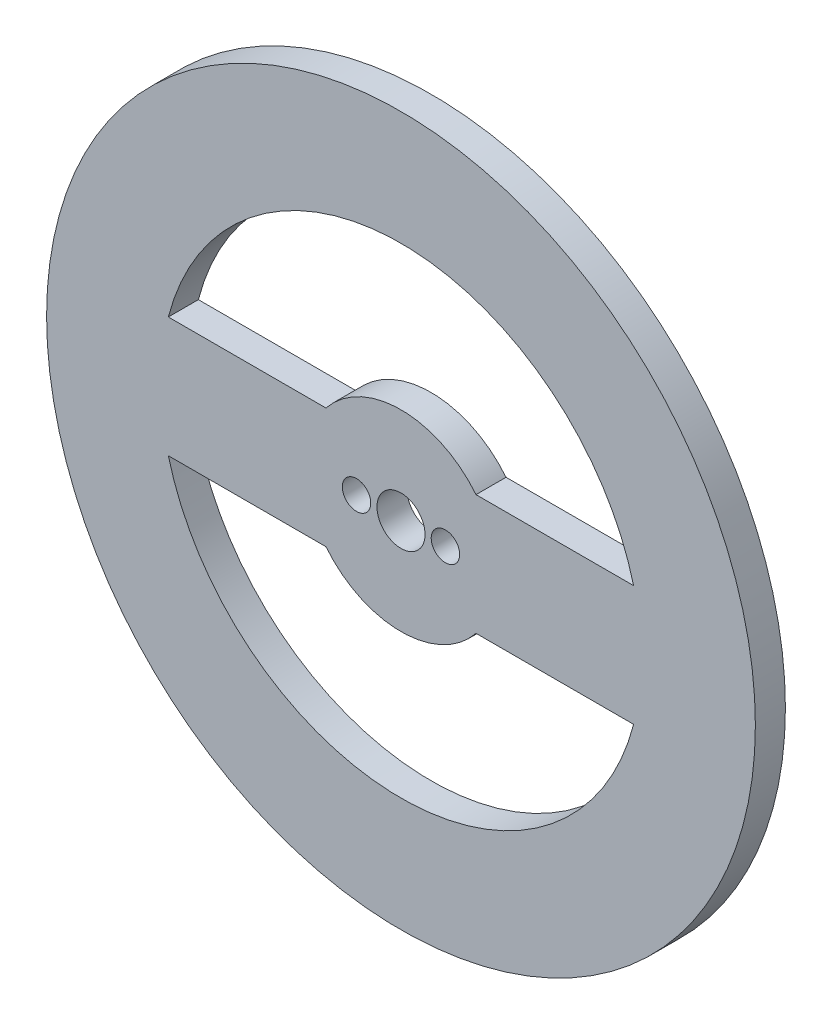
ISO-10303-21;
HEADER;
FILE_DESCRIPTION(('STEP AP214'),'2;1');
FILE_NAME('part.step','',(''),(''),'','','');
FILE_SCHEMA(('AUTOMOTIVE_DESIGN { 1 0 10303 214 1 1 1 1 }'));
ENDSEC;
DATA;
#1=APPLICATION_CONTEXT('core data for automotive mechanical design processes');
#2=APPLICATION_PROTOCOL_DEFINITION('international standard','automotive_design',2000,#1);
#3=PRODUCT_CONTEXT('',#1,'mechanical');
#4=PRODUCT('Part','Part','',(#3));
#5=PRODUCT_RELATED_PRODUCT_CATEGORY('part','',(#4));
#6=PRODUCT_DEFINITION_FORMATION('','',#4);
#7=PRODUCT_DEFINITION_CONTEXT('part definition',#1,'design');
#8=PRODUCT_DEFINITION('design','',#6,#7);
#9=PRODUCT_DEFINITION_SHAPE('','',#8);
#10=(LENGTH_UNIT() NAMED_UNIT(*) SI_UNIT(.MILLI.,.METRE.));
#11=(NAMED_UNIT(*) PLANE_ANGLE_UNIT() SI_UNIT($,.RADIAN.));
#12=(NAMED_UNIT(*) SI_UNIT($,.STERADIAN.) SOLID_ANGLE_UNIT());
#13=UNCERTAINTY_MEASURE_WITH_UNIT(LENGTH_MEASURE(1.E-05),#10,'distance_accuracy_value','');
#14=(GEOMETRIC_REPRESENTATION_CONTEXT(3) GLOBAL_UNCERTAINTY_ASSIGNED_CONTEXT((#13)) GLOBAL_UNIT_ASSIGNED_CONTEXT((#10,
#11,#12)) REPRESENTATION_CONTEXT('',''));
#15=CARTESIAN_POINT('',(0.,0.,0.));
#16=DIRECTION('',(0.,0.,1.));
#17=DIRECTION('',(1.,0.,0.));
#18=AXIS2_PLACEMENT_3D('',#15,#16,#17);
#19=CARTESIAN_POINT('',(0.,0.,3.175));
#20=DIRECTION('',(0.,0.,-1.));
#21=DIRECTION('',(-1.,0.,0.));
#22=AXIS2_PLACEMENT_3D('',#19,#20,#21);
#23=CYLINDRICAL_SURFACE('',#22,37.465);
#24=CARTESIAN_POINT('',(0.,0.,3.175));
#25=DIRECTION('',(0.,0.,1.));
#26=DIRECTION('',(1.,0.,0.));
#27=AXIS2_PLACEMENT_3D('',#24,#25,#26);
#28=CIRCLE('',#27,37.465);
#29=CARTESIAN_POINT('',(37.465,0.,3.175));
#30=VERTEX_POINT('',#29);
#31=EDGE_CURVE('E11',#30,#30,#28,.T.);
#32=ORIENTED_EDGE('',*,*,#31,.F.);
#33=EDGE_LOOP('',(#32));
#34=FACE_BOUND('',#33,.T.);
#35=CARTESIAN_POINT('',(0.,0.,0.));
#36=DIRECTION('',(0.,0.,1.));
#37=DIRECTION('',(1.,0.,0.));
#38=AXIS2_PLACEMENT_3D('',#35,#36,#37);
#39=CIRCLE('',#38,37.465);
#40=CARTESIAN_POINT('',(37.465,0.,0.));
#41=VERTEX_POINT('',#40);
#42=EDGE_CURVE('E35',#41,#41,#39,.T.);
#43=ORIENTED_EDGE('',*,*,#42,.T.);
#44=EDGE_LOOP('',(#43));
#45=FACE_BOUND('',#44,.T.);
#46=ADVANCED_FACE('F32',(#34,#45),#23,.T.);
#47=CARTESIAN_POINT('',(0.,0.,3.175));
#48=DIRECTION('',(0.,0.,1.));
#49=DIRECTION('',(1.,0.,0.));
#50=AXIS2_PLACEMENT_3D('',#47,#48,#49);
#51=PLANE('',#50);
#52=CARTESIAN_POINT('',(-4.69900000000336,0.,3.175));
#53=DIRECTION('',(0.,0.,-1.));
#54=DIRECTION('',(-1.,0.,0.));
#55=AXIS2_PLACEMENT_3D('',#52,#53,#54);
#56=CIRCLE('',#55,1.505);
#57=CARTESIAN_POINT('',(-6.20400000000336,0.,3.175));
#58=VERTEX_POINT('',#57);
#59=EDGE_CURVE('E246',#58,#58,#56,.T.);
#60=ORIENTED_EDGE('',*,*,#59,.T.);
#61=EDGE_LOOP('',(#60));
#62=FACE_BOUND('',#61,.T.);
#63=CARTESIAN_POINT('',(4.69899999999664,0.,3.175));
#64=DIRECTION('',(0.,0.,-1.));
#65=DIRECTION('',(-1.,0.,0.));
#66=AXIS2_PLACEMENT_3D('',#63,#64,#65);
#67=CIRCLE('',#66,1.505);
#68=CARTESIAN_POINT('',(3.19399999999664,0.,3.175));
#69=VERTEX_POINT('',#68);
#70=EDGE_CURVE('E253',#69,#69,#67,.T.);
#71=ORIENTED_EDGE('',*,*,#70,.T.);
#72=EDGE_LOOP('',(#71));
#73=FACE_BOUND('',#72,.T.);
#74=CARTESIAN_POINT('',(0.,0.,3.175));
#75=DIRECTION('',(0.,0.,1.));
#76=DIRECTION('',(1.,0.,0.));
#77=AXIS2_PLACEMENT_3D('',#74,#75,#76);
#78=CIRCLE('',#77,2.54);
#79=CARTESIAN_POINT('',(2.54,0.,3.175));
#80=VERTEX_POINT('',#79);
#81=EDGE_CURVE('E120',#80,#80,#78,.T.);
#82=ORIENTED_EDGE('',*,*,#81,.F.);
#83=EDGE_LOOP('',(#82));
#84=FACE_BOUND('',#83,.T.);
#85=CARTESIAN_POINT('',(0.,0.,3.175));
#86=DIRECTION('',(0.,0.,1.));
#87=DIRECTION('',(1.,0.,0.));
#88=AXIS2_PLACEMENT_3D('',#85,#86,#87);
#89=CIRCLE('',#88,25.4);
#90=CARTESIAN_POINT('',(-24.5934442484171,-6.35,3.175));
#91=VERTEX_POINT('',#90);
#92=CARTESIAN_POINT('',(24.5934442484171,-6.35,3.175));
#93=VERTEX_POINT('',#92);
#94=EDGE_CURVE('E46',#91,#93,#89,.T.);
#95=ORIENTED_EDGE('',*,*,#94,.F.);
#96=DIRECTION('',(-1.,0.,0.));
#97=VECTOR('',#96,1.);
#98=CARTESIAN_POINT('',(-24.5934442484171,-6.35,3.175));
#99=LINE('',#98,#97);
#100=CARTESIAN_POINT('',(-7.93114745796596,-6.35,3.175));
#101=VERTEX_POINT('',#100);
#102=EDGE_CURVE('E114',#101,#91,#99,.T.);
#103=ORIENTED_EDGE('',*,*,#102,.F.);
#104=CARTESIAN_POINT('',(0.,0.,3.175));
#105=DIRECTION('',(0.,0.,-1.));
#106=DIRECTION('',(1.,0.,0.));
#107=AXIS2_PLACEMENT_3D('',#104,#105,#106);
#108=CIRCLE('',#107,10.16);
#109=CARTESIAN_POINT('',(7.93114745796596,-6.35,3.175));
#110=VERTEX_POINT('',#109);
#111=EDGE_CURVE('E117',#110,#101,#108,.T.);
#112=ORIENTED_EDGE('',*,*,#111,.F.);
#113=DIRECTION('',(-1.,0.,0.));
#114=VECTOR('',#113,1.);
#115=CARTESIAN_POINT('',(7.93114745796596,-6.35,3.175));
#116=LINE('',#115,#114);
#117=EDGE_CURVE('E126',#93,#110,#116,.T.);
#118=ORIENTED_EDGE('',*,*,#117,.F.);
#119=EDGE_LOOP('',(#95,#103,#112,#118));
#120=FACE_BOUND('',#119,.T.);
#121=CARTESIAN_POINT('',(0.,0.,3.175));
#122=DIRECTION('',(0.,0.,-1.));
#123=DIRECTION('',(1.,0.,0.));
#124=AXIS2_PLACEMENT_3D('',#121,#122,#123);
#125=CIRCLE('',#124,10.16);
#126=CARTESIAN_POINT('',(-7.93114745796596,6.35,3.175));
#127=VERTEX_POINT('',#126);
#128=CARTESIAN_POINT('',(7.93114745796597,6.35,3.175));
#129=VERTEX_POINT('',#128);
#130=EDGE_CURVE('E133',#127,#129,#125,.T.);
#131=ORIENTED_EDGE('',*,*,#130,.F.);
#132=DIRECTION('',(1.,0.,0.));
#133=VECTOR('',#132,1.);
#134=CARTESIAN_POINT('',(-24.5934442484171,6.35,3.175));
#135=LINE('',#134,#133);
#136=CARTESIAN_POINT('',(-24.5934442484171,6.35000000000001,3.175));
#137=VERTEX_POINT('',#136);
#138=EDGE_CURVE('E141',#137,#127,#135,.T.);
#139=ORIENTED_EDGE('',*,*,#138,.F.);
#140=CARTESIAN_POINT('',(0.,0.,3.175));
#141=DIRECTION('',(0.,0.,1.));
#142=DIRECTION('',(1.,0.,0.));
#143=AXIS2_PLACEMENT_3D('',#140,#141,#142);
#144=CIRCLE('',#143,25.4);
#145=CARTESIAN_POINT('',(24.5934442484171,6.35,3.175));
#146=VERTEX_POINT('',#145);
#147=EDGE_CURVE('E155',#146,#137,#144,.T.);
#148=ORIENTED_EDGE('',*,*,#147,.F.);
#149=DIRECTION('',(1.,0.,0.));
#150=VECTOR('',#149,1.);
#151=CARTESIAN_POINT('',(7.93114745796597,6.35,3.175));
#152=LINE('',#151,#150);
#153=EDGE_CURVE('E152',#129,#146,#152,.T.);
#154=ORIENTED_EDGE('',*,*,#153,.F.);
#155=EDGE_LOOP('',(#131,#139,#148,#154));
#156=FACE_BOUND('',#155,.T.);
#157=ORIENTED_EDGE('',*,*,#31,.T.);
#158=EDGE_LOOP('',(#157));
#159=FACE_BOUND('',#158,.T.);
#160=ADVANCED_FACE('F177',(#62,#73,#84,#120,#156,#159),#51,.T.);
#161=CARTESIAN_POINT('',(0.,0.,0.));
#162=DIRECTION('',(0.,0.,1.));
#163=DIRECTION('',(1.,0.,0.));
#164=AXIS2_PLACEMENT_3D('',#161,#162,#163);
#165=PLANE('',#164);
#166=CARTESIAN_POINT('',(-4.69900000000336,0.,0.));
#167=DIRECTION('',(0.,0.,-1.));
#168=DIRECTION('',(-1.,0.,0.));
#169=AXIS2_PLACEMENT_3D('',#166,#167,#168);
#170=CIRCLE('',#169,1.505);
#171=CARTESIAN_POINT('',(-6.20400000000336,0.,0.));
#172=VERTEX_POINT('',#171);
#173=EDGE_CURVE('E248',#172,#172,#170,.T.);
#174=ORIENTED_EDGE('',*,*,#173,.F.);
#175=EDGE_LOOP('',(#174));
#176=FACE_BOUND('',#175,.T.);
#177=CARTESIAN_POINT('',(4.69899999999664,0.,0.));
#178=DIRECTION('',(0.,0.,-1.));
#179=DIRECTION('',(-1.,0.,0.));
#180=AXIS2_PLACEMENT_3D('',#177,#178,#179);
#181=CIRCLE('',#180,1.505);
#182=CARTESIAN_POINT('',(3.19399999999664,0.,0.));
#183=VERTEX_POINT('',#182);
#184=EDGE_CURVE('E250',#183,#183,#181,.T.);
#185=ORIENTED_EDGE('',*,*,#184,.F.);
#186=EDGE_LOOP('',(#185));
#187=FACE_BOUND('',#186,.T.);
#188=CARTESIAN_POINT('',(0.,0.,0.));
#189=DIRECTION('',(0.,0.,1.));
#190=DIRECTION('',(1.,0.,0.));
#191=AXIS2_PLACEMENT_3D('',#188,#189,#190);
#192=CIRCLE('',#191,2.54);
#193=CARTESIAN_POINT('',(2.54,0.,0.));
#194=VERTEX_POINT('',#193);
#195=EDGE_CURVE('E127',#194,#194,#192,.T.);
#196=ORIENTED_EDGE('',*,*,#195,.T.);
#197=EDGE_LOOP('',(#196));
#198=FACE_BOUND('',#197,.T.);
#199=DIRECTION('',(-1.,0.,0.));
#200=VECTOR('',#199,1.);
#201=CARTESIAN_POINT('',(-24.5934442484171,-6.35,0.));
#202=LINE('',#201,#200);
#203=CARTESIAN_POINT('',(-7.93114745796596,-6.35,0.));
#204=VERTEX_POINT('',#203);
#205=CARTESIAN_POINT('',(-24.5934442484171,-6.35,0.));
#206=VERTEX_POINT('',#205);
#207=EDGE_CURVE('E104',#204,#206,#202,.T.);
#208=ORIENTED_EDGE('',*,*,#207,.T.);
#209=CARTESIAN_POINT('',(0.,0.,0.));
#210=DIRECTION('',(0.,0.,1.));
#211=DIRECTION('',(1.,0.,0.));
#212=AXIS2_PLACEMENT_3D('',#209,#210,#211);
#213=CIRCLE('',#212,25.4);
#214=CARTESIAN_POINT('',(24.5934442484171,-6.35,0.));
#215=VERTEX_POINT('',#214);
#216=EDGE_CURVE('E98',#206,#215,#213,.T.);
#217=ORIENTED_EDGE('',*,*,#216,.T.);
#218=DIRECTION('',(-1.,0.,0.));
#219=VECTOR('',#218,1.);
#220=CARTESIAN_POINT('',(7.93114745796596,-6.35,0.));
#221=LINE('',#220,#219);
#222=CARTESIAN_POINT('',(7.93114745796596,-6.35,0.));
#223=VERTEX_POINT('',#222);
#224=EDGE_CURVE('E107',#215,#223,#221,.T.);
#225=ORIENTED_EDGE('',*,*,#224,.T.);
#226=CARTESIAN_POINT('',(0.,0.,0.));
#227=DIRECTION('',(0.,0.,-1.));
#228=DIRECTION('',(1.,0.,0.));
#229=AXIS2_PLACEMENT_3D('',#226,#227,#228);
#230=CIRCLE('',#229,10.16);
#231=EDGE_CURVE('E54',#223,#204,#230,.T.);
#232=ORIENTED_EDGE('',*,*,#231,.T.);
#233=EDGE_LOOP('',(#208,#217,#225,#232));
#234=FACE_BOUND('',#233,.T.);
#235=DIRECTION('',(1.,0.,0.));
#236=VECTOR('',#235,1.);
#237=CARTESIAN_POINT('',(-24.5934442484171,6.35,0.));
#238=LINE('',#237,#236);
#239=CARTESIAN_POINT('',(-24.5934442484171,6.35000000000001,0.));
#240=VERTEX_POINT('',#239);
#241=CARTESIAN_POINT('',(-7.93114745796596,6.35,0.));
#242=VERTEX_POINT('',#241);
#243=EDGE_CURVE('E147',#240,#242,#238,.T.);
#244=ORIENTED_EDGE('',*,*,#243,.T.);
#245=CARTESIAN_POINT('',(0.,0.,0.));
#246=DIRECTION('',(0.,0.,-1.));
#247=DIRECTION('',(1.,0.,0.));
#248=AXIS2_PLACEMENT_3D('',#245,#246,#247);
#249=CIRCLE('',#248,10.16);
#250=CARTESIAN_POINT('',(7.93114745796597,6.35,0.));
#251=VERTEX_POINT('',#250);
#252=EDGE_CURVE('E137',#242,#251,#249,.T.);
#253=ORIENTED_EDGE('',*,*,#252,.T.);
#254=DIRECTION('',(1.,0.,0.));
#255=VECTOR('',#254,1.);
#256=CARTESIAN_POINT('',(7.93114745796597,6.35,0.));
#257=LINE('',#256,#255);
#258=CARTESIAN_POINT('',(24.5934442484171,6.35,0.));
#259=VERTEX_POINT('',#258);
#260=EDGE_CURVE('E140',#251,#259,#257,.T.);
#261=ORIENTED_EDGE('',*,*,#260,.T.);
#262=CARTESIAN_POINT('',(0.,0.,0.));
#263=DIRECTION('',(0.,0.,1.));
#264=DIRECTION('',(1.,0.,0.));
#265=AXIS2_PLACEMENT_3D('',#262,#263,#264);
#266=CIRCLE('',#265,25.4);
#267=EDGE_CURVE('E144',#259,#240,#266,.T.);
#268=ORIENTED_EDGE('',*,*,#267,.T.);
#269=EDGE_LOOP('',(#244,#253,#261,#268));
#270=FACE_BOUND('',#269,.T.);
#271=ORIENTED_EDGE('',*,*,#42,.F.);
#272=EDGE_LOOP('',(#271));
#273=FACE_BOUND('',#272,.T.);
#274=ADVANCED_FACE('F111',(#176,#187,#198,#234,#270,#273),#165,.F.);
#275=CARTESIAN_POINT('',(0.,0.,0.));
#276=DIRECTION('',(0.,0.,1.));
#277=DIRECTION('',(1.,0.,0.));
#278=AXIS2_PLACEMENT_3D('',#275,#276,#277);
#279=CYLINDRICAL_SURFACE('',#278,10.16);
#280=ORIENTED_EDGE('',*,*,#130,.T.);
#281=DIRECTION('',(0.,0.,1.));
#282=VECTOR('',#281,1.);
#283=CARTESIAN_POINT('',(7.93114745796597,6.35,0.));
#284=LINE('',#283,#282);
#285=EDGE_CURVE('E150',#251,#129,#284,.T.);
#286=ORIENTED_EDGE('',*,*,#285,.F.);
#287=ORIENTED_EDGE('',*,*,#252,.F.);
#288=DIRECTION('',(0.,0.,1.));
#289=VECTOR('',#288,1.);
#290=CARTESIAN_POINT('',(-7.93114745796596,6.35,0.));
#291=LINE('',#290,#289);
#292=EDGE_CURVE('E160',#242,#127,#291,.T.);
#293=ORIENTED_EDGE('',*,*,#292,.T.);
#294=EDGE_LOOP('',(#280,#286,#287,#293));
#295=FACE_BOUND('',#294,.T.);
#296=ADVANCED_FACE('F184',(#295),#279,.T.);
#297=CARTESIAN_POINT('',(-24.5934442484171,6.35,0.));
#298=DIRECTION('',(0.,-1.,0.));
#299=DIRECTION('',(1.,0.,0.));
#300=AXIS2_PLACEMENT_3D('',#297,#298,#299);
#301=PLANE('',#300);
#302=ORIENTED_EDGE('',*,*,#138,.T.);
#303=ORIENTED_EDGE('',*,*,#292,.F.);
#304=ORIENTED_EDGE('',*,*,#243,.F.);
#305=DIRECTION('',(0.,0.,1.));
#306=VECTOR('',#305,1.);
#307=CARTESIAN_POINT('',(-24.5934442484171,6.35000000000001,0.));
#308=LINE('',#307,#306);
#309=EDGE_CURVE('E162',#240,#137,#308,.T.);
#310=ORIENTED_EDGE('',*,*,#309,.T.);
#311=EDGE_LOOP('',(#302,#303,#304,#310));
#312=FACE_BOUND('',#311,.T.);
#313=ADVANCED_FACE('F186',(#312),#301,.F.);
#314=CARTESIAN_POINT('',(0.,0.,0.));
#315=DIRECTION('',(0.,0.,1.));
#316=DIRECTION('',(1.,0.,0.));
#317=AXIS2_PLACEMENT_3D('',#314,#315,#316);
#318=CYLINDRICAL_SURFACE('',#317,25.4);
#319=ORIENTED_EDGE('',*,*,#147,.T.);
#320=ORIENTED_EDGE('',*,*,#309,.F.);
#321=ORIENTED_EDGE('',*,*,#267,.F.);
#322=DIRECTION('',(0.,0.,1.));
#323=VECTOR('',#322,1.);
#324=CARTESIAN_POINT('',(24.5934442484171,6.35,0.));
#325=LINE('',#324,#323);
#326=EDGE_CURVE('E164',#259,#146,#325,.T.);
#327=ORIENTED_EDGE('',*,*,#326,.T.);
#328=EDGE_LOOP('',(#319,#320,#321,#327));
#329=FACE_BOUND('',#328,.T.);
#330=ADVANCED_FACE('F181',(#329),#318,.F.);
#331=CARTESIAN_POINT('',(7.93114745796597,6.35,0.));
#332=DIRECTION('',(0.,-1.,0.));
#333=DIRECTION('',(1.,0.,0.));
#334=AXIS2_PLACEMENT_3D('',#331,#332,#333);
#335=PLANE('',#334);
#336=ORIENTED_EDGE('',*,*,#153,.T.);
#337=ORIENTED_EDGE('',*,*,#326,.F.);
#338=ORIENTED_EDGE('',*,*,#260,.F.);
#339=ORIENTED_EDGE('',*,*,#285,.T.);
#340=EDGE_LOOP('',(#336,#337,#338,#339));
#341=FACE_BOUND('',#340,.T.);
#342=ADVANCED_FACE('F170',(#341),#335,.F.);
#343=CARTESIAN_POINT('',(0.,0.,0.));
#344=DIRECTION('',(0.,0.,1.));
#345=DIRECTION('',(1.,0.,0.));
#346=AXIS2_PLACEMENT_3D('',#343,#344,#345);
#347=CYLINDRICAL_SURFACE('',#346,25.4);
#348=ORIENTED_EDGE('',*,*,#94,.T.);
#349=DIRECTION('',(0.,0.,1.));
#350=VECTOR('',#349,1.);
#351=CARTESIAN_POINT('',(24.5934442484171,-6.35,0.));
#352=LINE('',#351,#350);
#353=EDGE_CURVE('E94',#215,#93,#352,.T.);
#354=ORIENTED_EDGE('',*,*,#353,.F.);
#355=ORIENTED_EDGE('',*,*,#216,.F.);
#356=DIRECTION('',(0.,0.,1.));
#357=VECTOR('',#356,1.);
#358=CARTESIAN_POINT('',(-24.5934442484171,-6.35,0.));
#359=LINE('',#358,#357);
#360=EDGE_CURVE('E131',#206,#91,#359,.T.);
#361=ORIENTED_EDGE('',*,*,#360,.T.);
#362=EDGE_LOOP('',(#348,#354,#355,#361));
#363=FACE_BOUND('',#362,.T.);
#364=ADVANCED_FACE('F96',(#363),#347,.F.);
#365=CARTESIAN_POINT('',(-24.5934442484171,-6.35,0.));
#366=DIRECTION('',(0.,1.,0.));
#367=DIRECTION('',(-1.,0.,0.));
#368=AXIS2_PLACEMENT_3D('',#365,#366,#367);
#369=PLANE('',#368);
#370=ORIENTED_EDGE('',*,*,#102,.T.);
#371=ORIENTED_EDGE('',*,*,#360,.F.);
#372=ORIENTED_EDGE('',*,*,#207,.F.);
#373=DIRECTION('',(0.,0.,1.));
#374=VECTOR('',#373,1.);
#375=CARTESIAN_POINT('',(-7.93114745796596,-6.35,0.));
#376=LINE('',#375,#374);
#377=EDGE_CURVE('E134',#204,#101,#376,.T.);
#378=ORIENTED_EDGE('',*,*,#377,.T.);
#379=EDGE_LOOP('',(#370,#371,#372,#378));
#380=FACE_BOUND('',#379,.T.);
#381=ADVANCED_FACE('F218',(#380),#369,.F.);
#382=CARTESIAN_POINT('',(0.,0.,0.));
#383=DIRECTION('',(0.,0.,1.));
#384=DIRECTION('',(1.,0.,0.));
#385=AXIS2_PLACEMENT_3D('',#382,#383,#384);
#386=CYLINDRICAL_SURFACE('',#385,10.16);
#387=ORIENTED_EDGE('',*,*,#111,.T.);
#388=ORIENTED_EDGE('',*,*,#377,.F.);
#389=ORIENTED_EDGE('',*,*,#231,.F.);
#390=DIRECTION('',(0.,0.,1.));
#391=VECTOR('',#390,1.);
#392=CARTESIAN_POINT('',(7.93114745796596,-6.35,0.));
#393=LINE('',#392,#391);
#394=EDGE_CURVE('E103',#223,#110,#393,.T.);
#395=ORIENTED_EDGE('',*,*,#394,.T.);
#396=EDGE_LOOP('',(#387,#388,#389,#395));
#397=FACE_BOUND('',#396,.T.);
#398=ADVANCED_FACE('F222',(#397),#386,.T.);
#399=CARTESIAN_POINT('',(7.93114745796596,-6.35,0.));
#400=DIRECTION('',(0.,1.,0.));
#401=DIRECTION('',(0.,0.,1.));
#402=AXIS2_PLACEMENT_3D('',#399,#400,#401);
#403=PLANE('',#402);
#404=ORIENTED_EDGE('',*,*,#117,.T.);
#405=ORIENTED_EDGE('',*,*,#394,.F.);
#406=ORIENTED_EDGE('',*,*,#224,.F.);
#407=ORIENTED_EDGE('',*,*,#353,.T.);
#408=EDGE_LOOP('',(#404,#405,#406,#407));
#409=FACE_BOUND('',#408,.T.);
#410=ADVANCED_FACE('F108',(#409),#403,.F.);
#411=CARTESIAN_POINT('',(0.,0.,0.));
#412=DIRECTION('',(0.,0.,1.));
#413=DIRECTION('',(1.,0.,0.));
#414=AXIS2_PLACEMENT_3D('',#411,#412,#413);
#415=CYLINDRICAL_SURFACE('',#414,2.54);
#416=ORIENTED_EDGE('',*,*,#195,.F.);
#417=EDGE_LOOP('',(#416));
#418=FACE_BOUND('',#417,.T.);
#419=ORIENTED_EDGE('',*,*,#81,.T.);
#420=EDGE_LOOP('',(#419));
#421=FACE_BOUND('',#420,.T.);
#422=ADVANCED_FACE('F228',(#418,#421),#415,.F.);
#423=CARTESIAN_POINT('',(4.69899999999664,0.,3.175));
#424=DIRECTION('',(0.,0.,-1.));
#425=DIRECTION('',(-1.,0.,0.));
#426=AXIS2_PLACEMENT_3D('',#423,#424,#425);
#427=CYLINDRICAL_SURFACE('',#426,1.505);
#428=ORIENTED_EDGE('',*,*,#70,.F.);
#429=EDGE_LOOP('',(#428));
#430=FACE_BOUND('',#429,.T.);
#431=ORIENTED_EDGE('',*,*,#184,.T.);
#432=EDGE_LOOP('',(#431));
#433=FACE_BOUND('',#432,.T.);
#434=ADVANCED_FACE('F233',(#430,#433),#427,.F.);
#435=CARTESIAN_POINT('',(-4.69900000000336,0.,3.175));
#436=DIRECTION('',(0.,0.,-1.));
#437=DIRECTION('',(-1.,0.,0.));
#438=AXIS2_PLACEMENT_3D('',#435,#436,#437);
#439=CYLINDRICAL_SURFACE('',#438,1.505);
#440=ORIENTED_EDGE('',*,*,#59,.F.);
#441=EDGE_LOOP('',(#440));
#442=FACE_BOUND('',#441,.T.);
#443=ORIENTED_EDGE('',*,*,#173,.T.);
#444=EDGE_LOOP('',(#443));
#445=FACE_BOUND('',#444,.T.);
#446=ADVANCED_FACE('F237',(#442,#445),#439,.F.);
#447=CLOSED_SHELL('',(#46,#160,#274,#296,#313,#330,#342,#364,#381,#398,#410,#422,#434,#446));
#448=MANIFOLD_SOLID_BREP('B2',#447);
#449=ADVANCED_BREP_SHAPE_REPRESENTATION('',(#18,#448),#14);
#450=SHAPE_DEFINITION_REPRESENTATION(#9,#449);
ENDSEC;
END-ISO-10303-21;
